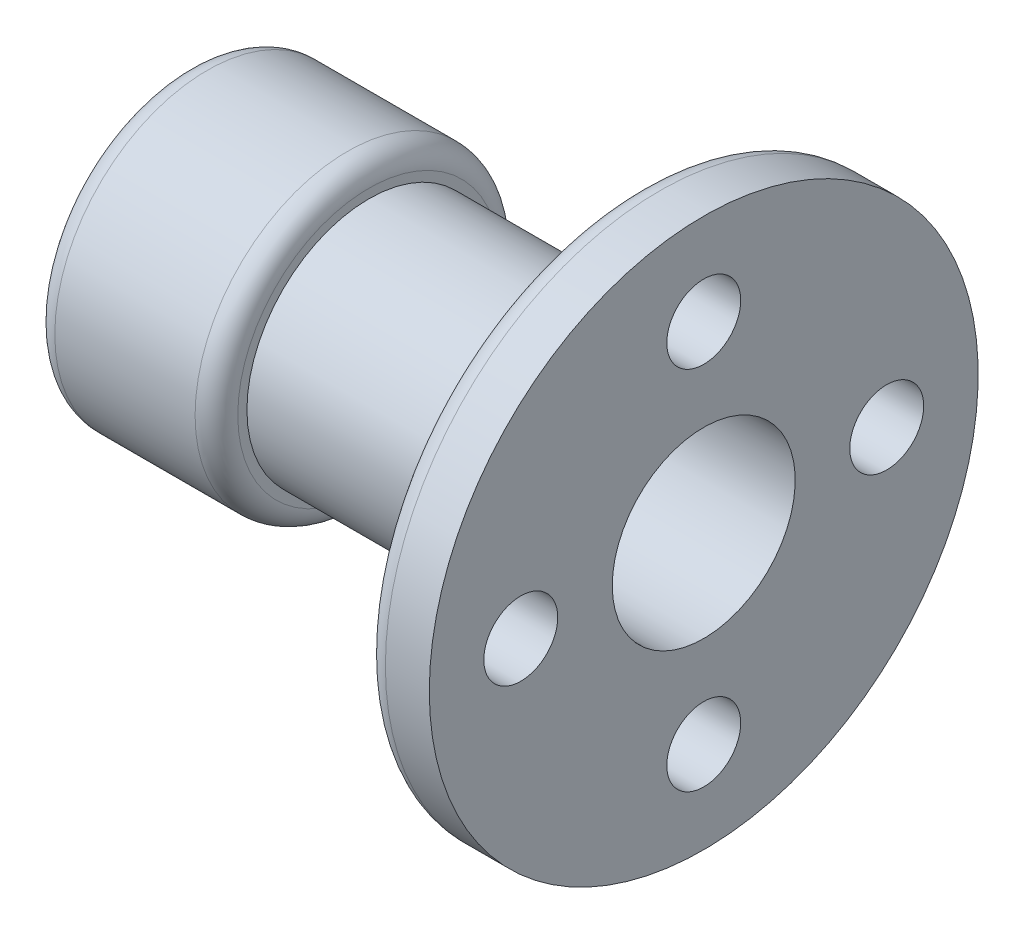
ISO-10303-21;
HEADER;
FILE_DESCRIPTION(('STEP AP214'),'2;1');
FILE_NAME('part.step','',(''),(''),'','','');
FILE_SCHEMA(('AUTOMOTIVE_DESIGN { 1 0 10303 214 1 1 1 1 }'));
ENDSEC;
DATA;
#1=APPLICATION_CONTEXT('core data for automotive mechanical design processes');
#2=APPLICATION_PROTOCOL_DEFINITION('international standard','automotive_design',2000,#1);
#3=PRODUCT_CONTEXT('',#1,'mechanical');
#4=PRODUCT('Part','Part','',(#3));
#5=PRODUCT_RELATED_PRODUCT_CATEGORY('part','',(#4));
#6=PRODUCT_DEFINITION_FORMATION('','',#4);
#7=PRODUCT_DEFINITION_CONTEXT('part definition',#1,'design');
#8=PRODUCT_DEFINITION('design','',#6,#7);
#9=PRODUCT_DEFINITION_SHAPE('','',#8);
#10=(LENGTH_UNIT() NAMED_UNIT(*) SI_UNIT(.MILLI.,.METRE.));
#11=(NAMED_UNIT(*) PLANE_ANGLE_UNIT() SI_UNIT($,.RADIAN.));
#12=(NAMED_UNIT(*) SI_UNIT($,.STERADIAN.) SOLID_ANGLE_UNIT());
#13=UNCERTAINTY_MEASURE_WITH_UNIT(LENGTH_MEASURE(1.E-05),#10,'distance_accuracy_value','');
#14=(GEOMETRIC_REPRESENTATION_CONTEXT(3) GLOBAL_UNCERTAINTY_ASSIGNED_CONTEXT((#13)) GLOBAL_UNIT_ASSIGNED_CONTEXT((#10,
#11,#12)) REPRESENTATION_CONTEXT('',''));
#15=CARTESIAN_POINT('',(0.,0.,0.));
#16=DIRECTION('',(0.,0.,1.));
#17=DIRECTION('',(1.,0.,0.));
#18=AXIS2_PLACEMENT_3D('',#15,#16,#17);
#19=CARTESIAN_POINT('',(-47.3611111111111,0.,0.));
#20=DIRECTION('',(-1.,0.,0.));
#21=DIRECTION('',(0.,0.,1.));
#22=AXIS2_PLACEMENT_3D('',#19,#20,#21);
#23=CYLINDRICAL_SURFACE('',#22,45.);
#24=CARTESIAN_POINT('',(27.3555555555556,0.,0.));
#25=DIRECTION('',(-1.,0.,0.));
#26=DIRECTION('',(0.,0.,1.));
#27=AXIS2_PLACEMENT_3D('',#24,#25,#26);
#28=CIRCLE('',#27,45.);
#29=CARTESIAN_POINT('',(27.3555555555556,0.,45.));
#30=VERTEX_POINT('',#29);
#31=EDGE_CURVE('E55',#30,#30,#28,.F.);
#32=ORIENTED_EDGE('',*,*,#31,.T.);
#33=EDGE_LOOP('',(#32));
#34=FACE_BOUND('',#33,.T.);
#35=CARTESIAN_POINT('',(34.5555555555556,0.,0.));
#36=DIRECTION('',(-1.,0.,0.));
#37=DIRECTION('',(0.,0.,1.));
#38=AXIS2_PLACEMENT_3D('',#35,#36,#37);
#39=CIRCLE('',#38,45.);
#40=CARTESIAN_POINT('',(34.5555555555556,0.,45.));
#41=VERTEX_POINT('',#40);
#42=EDGE_CURVE('E67',#41,#41,#39,.T.);
#43=ORIENTED_EDGE('',*,*,#42,.T.);
#44=EDGE_LOOP('',(#43));
#45=FACE_BOUND('',#44,.T.);
#46=ADVANCED_FACE('F40',(#34,#45),#23,.T.);
#47=CARTESIAN_POINT('',(23.8555555555556,0.,0.));
#48=DIRECTION('',(-1.,0.,0.));
#49=DIRECTION('',(0.,0.,1.));
#50=AXIS2_PLACEMENT_3D('',#47,#48,#49);
#51=PLANE('',#50);
#52=CARTESIAN_POINT('',(23.8555555555556,0.,0.));
#53=DIRECTION('',(-1.,0.,0.));
#54=DIRECTION('',(0.,0.,1.));
#55=AXIS2_PLACEMENT_3D('',#52,#53,#54);
#56=CIRCLE('',#55,41.5);
#57=CARTESIAN_POINT('',(23.8555555555556,0.,41.5));
#58=VERTEX_POINT('',#57);
#59=EDGE_CURVE('E60',#58,#58,#56,.T.);
#60=ORIENTED_EDGE('',*,*,#59,.T.);
#61=EDGE_LOOP('',(#60));
#62=FACE_BOUND('',#61,.T.);
#63=CARTESIAN_POINT('',(23.8555555555556,0.,0.));
#64=DIRECTION('',(-1.,0.,0.));
#65=DIRECTION('',(0.,0.,1.));
#66=AXIS2_PLACEMENT_3D('',#63,#64,#65);
#67=CIRCLE('',#66,23.5);
#68=CARTESIAN_POINT('',(23.8555555555556,0.,23.5));
#69=VERTEX_POINT('',#68);
#70=EDGE_CURVE('E58',#69,#69,#67,.F.);
#71=ORIENTED_EDGE('',*,*,#70,.T.);
#72=EDGE_LOOP('',(#71));
#73=FACE_BOUND('',#72,.T.);
#74=CARTESIAN_POINT('',(23.8555555555556,30.0000000000008,-1.15770559964953E-12));
#75=DIRECTION('',(-1.,0.,0.));
#76=DIRECTION('',(0.,0.,1.));
#77=AXIS2_PLACEMENT_3D('',#74,#75,#76);
#78=CIRCLE('',#77,6.06115168346749);
#79=CARTESIAN_POINT('',(23.8555555555556,30.0000000000008,6.06115168346633));
#80=VERTEX_POINT('',#79);
#81=EDGE_CURVE('E102',#80,#80,#78,.F.);
#82=ORIENTED_EDGE('',*,*,#81,.T.);
#83=EDGE_LOOP('',(#82));
#84=FACE_BOUND('',#83,.T.);
#85=CARTESIAN_POINT('',(23.8555555555556,-3.10562303716007E-13,-30.0000000000017));
#86=DIRECTION('',(-1.,0.,0.));
#87=DIRECTION('',(0.,0.,1.));
#88=AXIS2_PLACEMENT_3D('',#85,#86,#87);
#89=CIRCLE('',#88,6.06115168346815);
#90=CARTESIAN_POINT('',(23.8555555555556,-3.10562303716007E-13,-23.9388483165335));
#91=VERTEX_POINT('',#90);
#92=EDGE_CURVE('E101',#91,#91,#89,.F.);
#93=ORIENTED_EDGE('',*,*,#92,.T.);
#94=EDGE_LOOP('',(#93));
#95=FACE_BOUND('',#94,.T.);
#96=CARTESIAN_POINT('',(23.8555555555556,-30.0000000000008,-5.36580992217517E-13));
#97=DIRECTION('',(-1.,0.,0.));
#98=DIRECTION('',(0.,0.,1.));
#99=AXIS2_PLACEMENT_3D('',#96,#97,#98);
#100=CIRCLE('',#99,6.06115168346931);
#101=CARTESIAN_POINT('',(23.8555555555556,-30.0000000000008,6.06115168346877));
#102=VERTEX_POINT('',#101);
#103=EDGE_CURVE('E92',#102,#102,#100,.F.);
#104=ORIENTED_EDGE('',*,*,#103,.T.);
#105=EDGE_LOOP('',(#104));
#106=FACE_BOUND('',#105,.T.);
#107=CARTESIAN_POINT('',(23.8555555555556,3.14236244113449E-13,30.));
#108=DIRECTION('',(-1.,0.,0.));
#109=DIRECTION('',(0.,0.,1.));
#110=AXIS2_PLACEMENT_3D('',#107,#108,#109);
#111=CIRCLE('',#110,6.06115168346884);
#112=CARTESIAN_POINT('',(23.8555555555556,3.14236244113449E-13,36.0611516834688));
#113=VERTEX_POINT('',#112);
#114=EDGE_CURVE('E86',#113,#113,#111,.F.);
#115=ORIENTED_EDGE('',*,*,#114,.T.);
#116=EDGE_LOOP('',(#115));
#117=FACE_BOUND('',#116,.T.);
#118=ADVANCED_FACE('F115',(#62,#73,#84,#95,#106,#117),#51,.T.);
#119=CARTESIAN_POINT('',(34.5555555555556,0.,0.));
#120=DIRECTION('',(-1.,0.,0.));
#121=DIRECTION('',(0.,0.,1.));
#122=AXIS2_PLACEMENT_3D('',#119,#120,#121);
#123=PLANE('',#122);
#124=CARTESIAN_POINT('',(34.5555555555556,30.0000000000008,-1.15770559964953E-12));
#125=DIRECTION('',(1.,0.,0.));
#126=DIRECTION('',(0.,0.,-1.));
#127=AXIS2_PLACEMENT_3D('',#124,#125,#126);
#128=CIRCLE('',#127,6.06115168346749);
#129=CARTESIAN_POINT('',(34.5555555555556,30.0000000000008,-6.06115168346864));
#130=VERTEX_POINT('',#129);
#131=EDGE_CURVE('E84',#130,#130,#128,.T.);
#132=ORIENTED_EDGE('',*,*,#131,.F.);
#133=EDGE_LOOP('',(#132));
#134=FACE_BOUND('',#133,.T.);
#135=CARTESIAN_POINT('',(34.5555555555556,-3.10562303716007E-13,-30.0000000000017));
#136=DIRECTION('',(1.,0.,0.));
#137=DIRECTION('',(0.,0.,-1.));
#138=AXIS2_PLACEMENT_3D('',#135,#136,#137);
#139=CIRCLE('',#138,6.06115168346815);
#140=CARTESIAN_POINT('',(34.5555555555556,-3.10562303716007E-13,-36.0611516834698));
#141=VERTEX_POINT('',#140);
#142=EDGE_CURVE('E98',#141,#141,#139,.T.);
#143=ORIENTED_EDGE('',*,*,#142,.F.);
#144=EDGE_LOOP('',(#143));
#145=FACE_BOUND('',#144,.T.);
#146=CARTESIAN_POINT('',(34.5555555555556,-30.0000000000008,-5.36580992217517E-13));
#147=DIRECTION('',(1.,0.,0.));
#148=DIRECTION('',(0.,0.,-1.));
#149=AXIS2_PLACEMENT_3D('',#146,#147,#148);
#150=CIRCLE('',#149,6.06115168346931);
#151=CARTESIAN_POINT('',(34.5555555555556,-30.0000000000008,-6.06115168346984));
#152=VERTEX_POINT('',#151);
#153=EDGE_CURVE('E93',#152,#152,#150,.T.);
#154=ORIENTED_EDGE('',*,*,#153,.F.);
#155=EDGE_LOOP('',(#154));
#156=FACE_BOUND('',#155,.T.);
#157=CARTESIAN_POINT('',(34.5555555555556,3.14236244113449E-13,30.));
#158=DIRECTION('',(1.,0.,0.));
#159=DIRECTION('',(0.,0.,-1.));
#160=AXIS2_PLACEMENT_3D('',#157,#158,#159);
#161=CIRCLE('',#160,6.06115168346884);
#162=CARTESIAN_POINT('',(34.5555555555556,3.14236244113449E-13,23.9388483165312));
#163=VERTEX_POINT('',#162);
#164=EDGE_CURVE('E95',#163,#163,#161,.T.);
#165=ORIENTED_EDGE('',*,*,#164,.F.);
#166=EDGE_LOOP('',(#165));
#167=FACE_BOUND('',#166,.T.);
#168=ORIENTED_EDGE('',*,*,#42,.F.);
#169=EDGE_LOOP('',(#168));
#170=FACE_BOUND('',#169,.T.);
#171=CARTESIAN_POINT('',(34.5555555555556,0.,0.));
#172=DIRECTION('',(-1.,0.,0.));
#173=DIRECTION('',(0.,0.,1.));
#174=AXIS2_PLACEMENT_3D('',#171,#172,#173);
#175=CIRCLE('',#174,15.);
#176=CARTESIAN_POINT('',(34.5555555555556,0.,15.));
#177=VERTEX_POINT('',#176);
#178=EDGE_CURVE('E69',#177,#177,#175,.T.);
#179=ORIENTED_EDGE('',*,*,#178,.T.);
#180=EDGE_LOOP('',(#179));
#181=FACE_BOUND('',#180,.T.);
#182=ADVANCED_FACE('F121',(#134,#145,#156,#167,#170,#181),#123,.F.);
#183=CARTESIAN_POINT('',(-50.3444444444444,0.,0.));
#184=DIRECTION('',(-1.,0.,0.));
#185=DIRECTION('',(0.,0.,1.));
#186=AXIS2_PLACEMENT_3D('',#183,#184,#185);
#187=PLANE('',#186);
#188=CARTESIAN_POINT('',(-50.3444444444444,0.,0.));
#189=DIRECTION('',(-1.,0.,0.));
#190=DIRECTION('',(0.,0.,1.));
#191=AXIS2_PLACEMENT_3D('',#188,#189,#190);
#192=CIRCLE('',#191,21.5);
#193=CARTESIAN_POINT('',(-50.3444444444444,0.,21.5));
#194=VERTEX_POINT('',#193);
#195=EDGE_CURVE('E42',#194,#194,#192,.T.);
#196=ORIENTED_EDGE('',*,*,#195,.T.);
#197=EDGE_LOOP('',(#196));
#198=FACE_BOUND('',#197,.T.);
#199=CARTESIAN_POINT('',(-50.3444444444444,0.,0.));
#200=DIRECTION('',(-1.,0.,0.));
#201=DIRECTION('',(0.,0.,1.));
#202=AXIS2_PLACEMENT_3D('',#199,#200,#201);
#203=CIRCLE('',#202,19.);
#204=CARTESIAN_POINT('',(-50.3444444444444,0.,19.));
#205=VERTEX_POINT('',#204);
#206=EDGE_CURVE('E76',#205,#205,#203,.T.);
#207=ORIENTED_EDGE('',*,*,#206,.F.);
#208=EDGE_LOOP('',(#207));
#209=FACE_BOUND('',#208,.T.);
#210=ADVANCED_FACE('F127',(#198,#209),#187,.T.);
#211=CARTESIAN_POINT('',(-47.3611111111111,0.,0.));
#212=DIRECTION('',(-1.,0.,0.));
#213=DIRECTION('',(0.,0.,1.));
#214=AXIS2_PLACEMENT_3D('',#211,#212,#213);
#215=CYLINDRICAL_SURFACE('',#214,25.);
#216=CARTESIAN_POINT('',(-46.8444444444444,0.,0.));
#217=DIRECTION('',(-1.,0.,0.));
#218=DIRECTION('',(0.,0.,1.));
#219=AXIS2_PLACEMENT_3D('',#216,#217,#218);
#220=CIRCLE('',#219,25.);
#221=CARTESIAN_POINT('',(-46.8444444444444,0.,25.));
#222=VERTEX_POINT('',#221);
#223=EDGE_CURVE('E10',#222,#222,#220,.F.);
#224=ORIENTED_EDGE('',*,*,#223,.T.);
#225=EDGE_LOOP('',(#224));
#226=FACE_BOUND('',#225,.T.);
#227=CARTESIAN_POINT('',(-23.8444444444444,0.,0.));
#228=DIRECTION('',(-1.,0.,0.));
#229=DIRECTION('',(0.,0.,1.));
#230=AXIS2_PLACEMENT_3D('',#227,#228,#229);
#231=CIRCLE('',#230,25.);
#232=CARTESIAN_POINT('',(-23.8444444444444,0.,25.));
#233=VERTEX_POINT('',#232);
#234=EDGE_CURVE('E68',#233,#233,#231,.T.);
#235=ORIENTED_EDGE('',*,*,#234,.T.);
#236=EDGE_LOOP('',(#235));
#237=FACE_BOUND('',#236,.T.);
#238=ADVANCED_FACE('F161',(#226,#237),#215,.T.);
#239=CARTESIAN_POINT('',(-20.3444444444444,0.,0.));
#240=DIRECTION('',(-1.,0.,0.));
#241=DIRECTION('',(0.,0.,1.));
#242=AXIS2_PLACEMENT_3D('',#239,#240,#241);
#243=PLANE('',#242);
#244=CARTESIAN_POINT('',(-20.3444444444444,0.,0.));
#245=DIRECTION('',(-1.,0.,0.));
#246=DIRECTION('',(0.,0.,1.));
#247=AXIS2_PLACEMENT_3D('',#244,#245,#246);
#248=CIRCLE('',#247,21.5);
#249=CARTESIAN_POINT('',(-20.3444444444444,0.,21.5));
#250=VERTEX_POINT('',#249);
#251=EDGE_CURVE('E62',#250,#250,#248,.F.);
#252=ORIENTED_EDGE('',*,*,#251,.T.);
#253=EDGE_LOOP('',(#252));
#254=FACE_BOUND('',#253,.T.);
#255=CARTESIAN_POINT('',(-20.3444444444444,0.,0.));
#256=DIRECTION('',(-1.,0.,0.));
#257=DIRECTION('',(0.,0.,1.));
#258=AXIS2_PLACEMENT_3D('',#255,#256,#257);
#259=CIRCLE('',#258,20.);
#260=CARTESIAN_POINT('',(-20.3444444444444,0.,20.));
#261=VERTEX_POINT('',#260);
#262=EDGE_CURVE('E71',#261,#261,#259,.T.);
#263=ORIENTED_EDGE('',*,*,#262,.T.);
#264=EDGE_LOOP('',(#263));
#265=FACE_BOUND('',#264,.T.);
#266=ADVANCED_FACE('F178',(#254,#265),#243,.F.);
#267=CARTESIAN_POINT('',(-47.3611111111111,0.,0.));
#268=DIRECTION('',(-1.,0.,0.));
#269=DIRECTION('',(0.,0.,1.));
#270=AXIS2_PLACEMENT_3D('',#267,#268,#269);
#271=CYLINDRICAL_SURFACE('',#270,20.);
#272=CARTESIAN_POINT('',(20.3555555555556,0.,0.));
#273=DIRECTION('',(-1.,0.,0.));
#274=DIRECTION('',(0.,0.,1.));
#275=AXIS2_PLACEMENT_3D('',#272,#273,#274);
#276=CIRCLE('',#275,20.);
#277=CARTESIAN_POINT('',(20.3555555555556,0.,20.));
#278=VERTEX_POINT('',#277);
#279=EDGE_CURVE('E48',#278,#278,#276,.T.);
#280=ORIENTED_EDGE('',*,*,#279,.T.);
#281=EDGE_LOOP('',(#280));
#282=FACE_BOUND('',#281,.T.);
#283=ORIENTED_EDGE('',*,*,#262,.F.);
#284=EDGE_LOOP('',(#283));
#285=FACE_BOUND('',#284,.T.);
#286=ADVANCED_FACE('F160',(#282,#285),#271,.T.);
#287=CARTESIAN_POINT('',(-47.3611111111111,0.,0.));
#288=DIRECTION('',(-1.,0.,0.));
#289=DIRECTION('',(0.,0.,1.));
#290=AXIS2_PLACEMENT_3D('',#287,#288,#289);
#291=CYLINDRICAL_SURFACE('',#290,19.);
#292=ORIENTED_EDGE('',*,*,#206,.T.);
#293=EDGE_LOOP('',(#292));
#294=FACE_BOUND('',#293,.T.);
#295=CARTESIAN_POINT('',(-26.3444444444444,0.,0.));
#296=DIRECTION('',(-1.,0.,0.));
#297=DIRECTION('',(0.,0.,1.));
#298=AXIS2_PLACEMENT_3D('',#295,#296,#297);
#299=CIRCLE('',#298,19.);
#300=CARTESIAN_POINT('',(-26.3444444444444,0.,19.));
#301=VERTEX_POINT('',#300);
#302=EDGE_CURVE('E78',#301,#301,#299,.T.);
#303=ORIENTED_EDGE('',*,*,#302,.F.);
#304=EDGE_LOOP('',(#303));
#305=FACE_BOUND('',#304,.T.);
#306=ADVANCED_FACE('F145',(#294,#305),#291,.F.);
#307=CARTESIAN_POINT('',(-26.3444444444444,0.,0.));
#308=DIRECTION('',(-1.,0.,0.));
#309=DIRECTION('',(0.,0.,1.));
#310=AXIS2_PLACEMENT_3D('',#307,#308,#309);
#311=PLANE('',#310);
#312=ORIENTED_EDGE('',*,*,#302,.T.);
#313=EDGE_LOOP('',(#312));
#314=FACE_BOUND('',#313,.T.);
#315=CARTESIAN_POINT('',(-26.3444444444444,0.,0.));
#316=DIRECTION('',(-1.,0.,0.));
#317=DIRECTION('',(0.,0.,1.));
#318=AXIS2_PLACEMENT_3D('',#315,#316,#317);
#319=CIRCLE('',#318,15.);
#320=CARTESIAN_POINT('',(-26.3444444444444,0.,15.));
#321=VERTEX_POINT('',#320);
#322=EDGE_CURVE('E85',#321,#321,#319,.T.);
#323=ORIENTED_EDGE('',*,*,#322,.F.);
#324=EDGE_LOOP('',(#323));
#325=FACE_BOUND('',#324,.T.);
#326=ADVANCED_FACE('F129',(#314,#325),#311,.T.);
#327=CARTESIAN_POINT('',(-47.3611111111111,0.,0.));
#328=DIRECTION('',(-1.,0.,0.));
#329=DIRECTION('',(0.,0.,1.));
#330=AXIS2_PLACEMENT_3D('',#327,#328,#329);
#331=CYLINDRICAL_SURFACE('',#330,15.);
#332=ORIENTED_EDGE('',*,*,#322,.T.);
#333=EDGE_LOOP('',(#332));
#334=FACE_BOUND('',#333,.T.);
#335=ORIENTED_EDGE('',*,*,#178,.F.);
#336=EDGE_LOOP('',(#335));
#337=FACE_BOUND('',#336,.T.);
#338=ADVANCED_FACE('F139',(#334,#337),#331,.F.);
#339=CARTESIAN_POINT('',(-50.3454444444444,3.14236244113449E-13,30.));
#340=DIRECTION('',(1.,0.,0.));
#341=DIRECTION('',(0.,0.,-1.));
#342=AXIS2_PLACEMENT_3D('',#339,#340,#341);
#343=CYLINDRICAL_SURFACE('',#342,6.06115168346884);
#344=ORIENTED_EDGE('',*,*,#114,.F.);
#345=EDGE_LOOP('',(#344));
#346=FACE_BOUND('',#345,.T.);
#347=ORIENTED_EDGE('',*,*,#164,.T.);
#348=EDGE_LOOP('',(#347));
#349=FACE_BOUND('',#348,.T.);
#350=ADVANCED_FACE('F126',(#346,#349),#343,.F.);
#351=CARTESIAN_POINT('',(-50.3454444444444,-30.0000000000008,-5.36580992217517E-13));
#352=DIRECTION('',(1.,0.,0.));
#353=DIRECTION('',(0.,0.,-1.));
#354=AXIS2_PLACEMENT_3D('',#351,#352,#353);
#355=CYLINDRICAL_SURFACE('',#354,6.06115168346931);
#356=ORIENTED_EDGE('',*,*,#103,.F.);
#357=EDGE_LOOP('',(#356));
#358=FACE_BOUND('',#357,.T.);
#359=ORIENTED_EDGE('',*,*,#153,.T.);
#360=EDGE_LOOP('',(#359));
#361=FACE_BOUND('',#360,.T.);
#362=ADVANCED_FACE('F149',(#358,#361),#355,.F.);
#363=CARTESIAN_POINT('',(-50.3454444444444,-3.10562303716007E-13,-30.0000000000017));
#364=DIRECTION('',(1.,0.,0.));
#365=DIRECTION('',(0.,0.,-1.));
#366=AXIS2_PLACEMENT_3D('',#363,#364,#365);
#367=CYLINDRICAL_SURFACE('',#366,6.06115168346815);
#368=ORIENTED_EDGE('',*,*,#92,.F.);
#369=EDGE_LOOP('',(#368));
#370=FACE_BOUND('',#369,.T.);
#371=ORIENTED_EDGE('',*,*,#142,.T.);
#372=EDGE_LOOP('',(#371));
#373=FACE_BOUND('',#372,.T.);
#374=ADVANCED_FACE('F118',(#370,#373),#367,.F.);
#375=CARTESIAN_POINT('',(-50.3454444444444,30.0000000000008,-1.15770559964953E-12));
#376=DIRECTION('',(1.,0.,0.));
#377=DIRECTION('',(0.,0.,-1.));
#378=AXIS2_PLACEMENT_3D('',#375,#376,#377);
#379=CYLINDRICAL_SURFACE('',#378,6.06115168346749);
#380=ORIENTED_EDGE('',*,*,#81,.F.);
#381=EDGE_LOOP('',(#380));
#382=FACE_BOUND('',#381,.T.);
#383=ORIENTED_EDGE('',*,*,#131,.T.);
#384=EDGE_LOOP('',(#383));
#385=FACE_BOUND('',#384,.T.);
#386=ADVANCED_FACE('F113',(#382,#385),#379,.F.);
#387=CARTESIAN_POINT('',(-23.8444444444444,0.,0.));
#388=DIRECTION('',(-1.,0.,0.));
#389=DIRECTION('',(0.,0.,1.));
#390=AXIS2_PLACEMENT_3D('',#387,#388,#389);
#391=TOROIDAL_SURFACE('',#390,21.5,3.5);
#392=ORIENTED_EDGE('',*,*,#251,.F.);
#393=EDGE_LOOP('',(#392));
#394=FACE_BOUND('',#393,.T.);
#395=ORIENTED_EDGE('',*,*,#234,.F.);
#396=EDGE_LOOP('',(#395));
#397=FACE_BOUND('',#396,.T.);
#398=ADVANCED_FACE('F117',(#394,#397),#391,.T.);
#399=CARTESIAN_POINT('',(27.3555555555556,0.,0.));
#400=DIRECTION('',(-1.,0.,0.));
#401=DIRECTION('',(0.,0.,1.));
#402=AXIS2_PLACEMENT_3D('',#399,#400,#401);
#403=TOROIDAL_SURFACE('',#402,41.5,3.5);
#404=ORIENTED_EDGE('',*,*,#31,.F.);
#405=EDGE_LOOP('',(#404));
#406=FACE_BOUND('',#405,.T.);
#407=ORIENTED_EDGE('',*,*,#59,.F.);
#408=EDGE_LOOP('',(#407));
#409=FACE_BOUND('',#408,.T.);
#410=ADVANCED_FACE('F193',(#406,#409),#403,.T.);
#411=CARTESIAN_POINT('',(20.3555555555556,0.,0.));
#412=DIRECTION('',(-1.,0.,0.));
#413=DIRECTION('',(0.,0.,1.));
#414=AXIS2_PLACEMENT_3D('',#411,#412,#413);
#415=TOROIDAL_SURFACE('',#414,23.5,3.5);
#416=ORIENTED_EDGE('',*,*,#70,.F.);
#417=EDGE_LOOP('',(#416));
#418=FACE_BOUND('',#417,.T.);
#419=ORIENTED_EDGE('',*,*,#279,.F.);
#420=EDGE_LOOP('',(#419));
#421=FACE_BOUND('',#420,.T.);
#422=ADVANCED_FACE('F188',(#418,#421),#415,.F.);
#423=CARTESIAN_POINT('',(-46.8444444444444,0.,0.));
#424=DIRECTION('',(-1.,0.,0.));
#425=DIRECTION('',(0.,0.,1.));
#426=AXIS2_PLACEMENT_3D('',#423,#424,#425);
#427=TOROIDAL_SURFACE('',#426,21.5,3.5);
#428=ORIENTED_EDGE('',*,*,#223,.F.);
#429=EDGE_LOOP('',(#428));
#430=FACE_BOUND('',#429,.T.);
#431=ORIENTED_EDGE('',*,*,#195,.F.);
#432=EDGE_LOOP('',(#431));
#433=FACE_BOUND('',#432,.T.);
#434=ADVANCED_FACE('F39',(#430,#433),#427,.T.);
#435=CLOSED_SHELL('',(#46,#118,#182,#210,#238,#266,#286,#306,#326,#338,#350,#362,#374,#386,#398,
#410,#422,#434));
#436=MANIFOLD_SOLID_BREP('B2',#435);
#437=ADVANCED_BREP_SHAPE_REPRESENTATION('',(#18,#436),#14);
#438=SHAPE_DEFINITION_REPRESENTATION(#9,#437);
ENDSEC;
END-ISO-10303-21;
